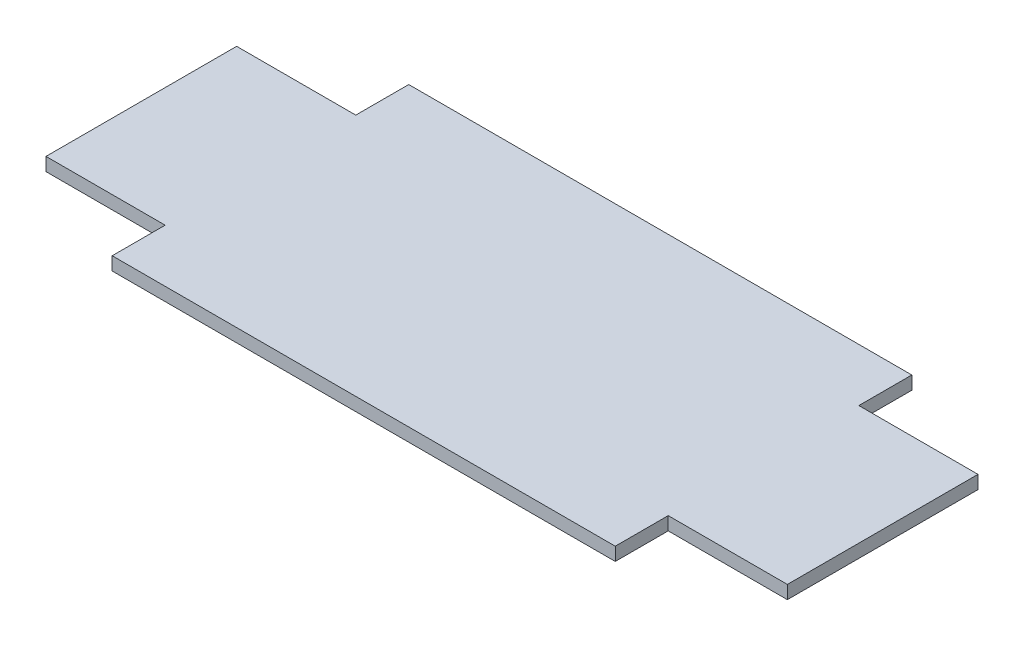
ISO-10303-21;
HEADER;
FILE_DESCRIPTION(('STEP AP214'),'2;1');
FILE_NAME('part.step','',(''),(''),'','','');
FILE_SCHEMA(('AUTOMOTIVE_DESIGN { 1 0 10303 214 1 1 1 1 }'));
ENDSEC;
DATA;
#1=APPLICATION_CONTEXT('core data for automotive mechanical design processes');
#2=APPLICATION_PROTOCOL_DEFINITION('international standard','automotive_design',2000,#1);
#3=PRODUCT_CONTEXT('',#1,'mechanical');
#4=PRODUCT('Part','Part','',(#3));
#5=PRODUCT_RELATED_PRODUCT_CATEGORY('part','',(#4));
#6=PRODUCT_DEFINITION_FORMATION('','',#4);
#7=PRODUCT_DEFINITION_CONTEXT('part definition',#1,'design');
#8=PRODUCT_DEFINITION('design','',#6,#7);
#9=PRODUCT_DEFINITION_SHAPE('','',#8);
#10=(LENGTH_UNIT() NAMED_UNIT(*) SI_UNIT(.MILLI.,.METRE.));
#11=(NAMED_UNIT(*) PLANE_ANGLE_UNIT() SI_UNIT($,.RADIAN.));
#12=(NAMED_UNIT(*) SI_UNIT($,.STERADIAN.) SOLID_ANGLE_UNIT());
#13=UNCERTAINTY_MEASURE_WITH_UNIT(LENGTH_MEASURE(1.E-05),#10,'distance_accuracy_value','');
#14=(GEOMETRIC_REPRESENTATION_CONTEXT(3) GLOBAL_UNCERTAINTY_ASSIGNED_CONTEXT((#13)) GLOBAL_UNIT_ASSIGNED_CONTEXT((#10,
#11,#12)) REPRESENTATION_CONTEXT('',''));
#15=CARTESIAN_POINT('',(0.,0.,0.));
#16=DIRECTION('',(0.,0.,1.));
#17=DIRECTION('',(1.,0.,0.));
#18=AXIS2_PLACEMENT_3D('',#15,#16,#17);
#19=CARTESIAN_POINT('',(235.,5.,112.));
#20=DIRECTION('',(-1.,0.,0.));
#21=DIRECTION('',(0.,0.,1.));
#22=AXIS2_PLACEMENT_3D('',#19,#20,#21);
#23=PLANE('',#22);
#24=DIRECTION('',(0.,0.,-1.));
#25=VECTOR('',#24,1.);
#26=CARTESIAN_POINT('',(235.,0.,112.));
#27=LINE('',#26,#25);
#28=CARTESIAN_POINT('',(235.,0.,112.));
#29=VERTEX_POINT('',#28);
#30=CARTESIAN_POINT('',(235.,0.,92.));
#31=VERTEX_POINT('',#30);
#32=EDGE_CURVE('E153',#29,#31,#27,.T.);
#33=ORIENTED_EDGE('',*,*,#32,.T.);
#34=DIRECTION('',(0.,-1.,0.));
#35=VECTOR('',#34,1.);
#36=CARTESIAN_POINT('',(235.,5.,92.));
#37=LINE('',#36,#35);
#38=CARTESIAN_POINT('',(235.,5.,92.));
#39=VERTEX_POINT('',#38);
#40=EDGE_CURVE('E11',#39,#31,#37,.T.);
#41=ORIENTED_EDGE('',*,*,#40,.F.);
#42=DIRECTION('',(0.,0.,-1.));
#43=VECTOR('',#42,1.);
#44=CARTESIAN_POINT('',(235.,5.,112.));
#45=LINE('',#44,#43);
#46=CARTESIAN_POINT('',(235.,5.,112.));
#47=VERTEX_POINT('',#46);
#48=EDGE_CURVE('E175',#47,#39,#45,.T.);
#49=ORIENTED_EDGE('',*,*,#48,.F.);
#50=DIRECTION('',(0.,-1.,0.));
#51=VECTOR('',#50,1.);
#52=CARTESIAN_POINT('',(235.,5.,112.));
#53=LINE('',#52,#51);
#54=EDGE_CURVE('E149',#47,#29,#53,.T.);
#55=ORIENTED_EDGE('',*,*,#54,.T.);
#56=EDGE_LOOP('',(#33,#41,#49,#55));
#57=FACE_BOUND('',#56,.T.);
#58=ADVANCED_FACE('F33',(#57),#23,.F.);
#59=CARTESIAN_POINT('',(235.,5.,92.));
#60=DIRECTION('',(0.,0.,-1.));
#61=DIRECTION('',(-1.,0.,0.));
#62=AXIS2_PLACEMENT_3D('',#59,#60,#61);
#63=PLANE('',#62);
#64=DIRECTION('',(1.,0.,0.));
#65=VECTOR('',#64,1.);
#66=CARTESIAN_POINT('',(235.,0.,92.));
#67=LINE('',#66,#65);
#68=CARTESIAN_POINT('',(280.,0.,92.));
#69=VERTEX_POINT('',#68);
#70=EDGE_CURVE('E156',#31,#69,#67,.T.);
#71=ORIENTED_EDGE('',*,*,#70,.T.);
#72=DIRECTION('',(0.,-1.,0.));
#73=VECTOR('',#72,1.);
#74=CARTESIAN_POINT('',(280.,5.,92.));
#75=LINE('',#74,#73);
#76=CARTESIAN_POINT('',(280.,5.,92.));
#77=VERTEX_POINT('',#76);
#78=EDGE_CURVE('E41',#77,#69,#75,.T.);
#79=ORIENTED_EDGE('',*,*,#78,.F.);
#80=DIRECTION('',(1.,0.,0.));
#81=VECTOR('',#80,1.);
#82=CARTESIAN_POINT('',(235.,5.,92.));
#83=LINE('',#82,#81);
#84=EDGE_CURVE('E104',#39,#77,#83,.T.);
#85=ORIENTED_EDGE('',*,*,#84,.F.);
#86=ORIENTED_EDGE('',*,*,#40,.T.);
#87=EDGE_LOOP('',(#71,#79,#85,#86));
#88=FACE_BOUND('',#87,.T.);
#89=ADVANCED_FACE('F253',(#88),#63,.F.);
#90=CARTESIAN_POINT('',(280.,5.,92.));
#91=DIRECTION('',(-1.,0.,0.));
#92=DIRECTION('',(0.,0.,1.));
#93=AXIS2_PLACEMENT_3D('',#90,#91,#92);
#94=PLANE('',#93);
#95=DIRECTION('',(0.,0.,-1.));
#96=VECTOR('',#95,1.);
#97=CARTESIAN_POINT('',(280.,0.,92.));
#98=LINE('',#97,#96);
#99=CARTESIAN_POINT('',(280.,0.,20.));
#100=VERTEX_POINT('',#99);
#101=EDGE_CURVE('E158',#69,#100,#98,.T.);
#102=ORIENTED_EDGE('',*,*,#101,.T.);
#103=DIRECTION('',(0.,-1.,0.));
#104=VECTOR('',#103,1.);
#105=CARTESIAN_POINT('',(280.,5.,20.));
#106=LINE('',#105,#104);
#107=CARTESIAN_POINT('',(280.,5.,20.));
#108=VERTEX_POINT('',#107);
#109=EDGE_CURVE('E194',#108,#100,#106,.T.);
#110=ORIENTED_EDGE('',*,*,#109,.F.);
#111=DIRECTION('',(0.,0.,-1.));
#112=VECTOR('',#111,1.);
#113=CARTESIAN_POINT('',(280.,5.,92.));
#114=LINE('',#113,#112);
#115=EDGE_CURVE('E202',#77,#108,#114,.T.);
#116=ORIENTED_EDGE('',*,*,#115,.F.);
#117=ORIENTED_EDGE('',*,*,#78,.T.);
#118=EDGE_LOOP('',(#102,#110,#116,#117));
#119=FACE_BOUND('',#118,.T.);
#120=ADVANCED_FACE('F200',(#119),#94,.F.);
#121=CARTESIAN_POINT('',(235.,5.,20.));
#122=DIRECTION('',(0.,0.,1.));
#123=DIRECTION('',(1.,0.,0.));
#124=AXIS2_PLACEMENT_3D('',#121,#122,#123);
#125=PLANE('',#124);
#126=DIRECTION('',(-1.,0.,0.));
#127=VECTOR('',#126,1.);
#128=CARTESIAN_POINT('',(235.,0.,20.));
#129=LINE('',#128,#127);
#130=CARTESIAN_POINT('',(235.,0.,20.));
#131=VERTEX_POINT('',#130);
#132=EDGE_CURVE('E160',#100,#131,#129,.T.);
#133=ORIENTED_EDGE('',*,*,#132,.T.);
#134=DIRECTION('',(0.,-1.,0.));
#135=VECTOR('',#134,1.);
#136=CARTESIAN_POINT('',(235.,5.,20.));
#137=LINE('',#136,#135);
#138=CARTESIAN_POINT('',(235.,5.,20.));
#139=VERTEX_POINT('',#138);
#140=EDGE_CURVE('E191',#139,#131,#137,.T.);
#141=ORIENTED_EDGE('',*,*,#140,.F.);
#142=DIRECTION('',(-1.,0.,0.));
#143=VECTOR('',#142,1.);
#144=CARTESIAN_POINT('',(235.,5.,20.));
#145=LINE('',#144,#143);
#146=EDGE_CURVE('E220',#108,#139,#145,.T.);
#147=ORIENTED_EDGE('',*,*,#146,.F.);
#148=ORIENTED_EDGE('',*,*,#109,.T.);
#149=EDGE_LOOP('',(#133,#141,#147,#148));
#150=FACE_BOUND('',#149,.T.);
#151=ADVANCED_FACE('F211',(#150),#125,.F.);
#152=CARTESIAN_POINT('',(235.,5.,0.));
#153=DIRECTION('',(-1.,0.,0.));
#154=DIRECTION('',(0.,0.,1.));
#155=AXIS2_PLACEMENT_3D('',#152,#153,#154);
#156=PLANE('',#155);
#157=DIRECTION('',(0.,0.,-1.));
#158=VECTOR('',#157,1.);
#159=CARTESIAN_POINT('',(235.,0.,0.));
#160=LINE('',#159,#158);
#161=CARTESIAN_POINT('',(235.,0.,0.));
#162=VERTEX_POINT('',#161);
#163=EDGE_CURVE('E162',#131,#162,#160,.T.);
#164=ORIENTED_EDGE('',*,*,#163,.T.);
#165=DIRECTION('',(0.,-1.,0.));
#166=VECTOR('',#165,1.);
#167=CARTESIAN_POINT('',(235.,5.,0.));
#168=LINE('',#167,#166);
#169=CARTESIAN_POINT('',(235.,5.,0.));
#170=VERTEX_POINT('',#169);
#171=EDGE_CURVE('E188',#170,#162,#168,.T.);
#172=ORIENTED_EDGE('',*,*,#171,.F.);
#173=DIRECTION('',(0.,0.,-1.));
#174=VECTOR('',#173,1.);
#175=CARTESIAN_POINT('',(235.,5.,0.));
#176=LINE('',#175,#174);
#177=EDGE_CURVE('E217',#139,#170,#176,.T.);
#178=ORIENTED_EDGE('',*,*,#177,.F.);
#179=ORIENTED_EDGE('',*,*,#140,.T.);
#180=EDGE_LOOP('',(#164,#172,#178,#179));
#181=FACE_BOUND('',#180,.T.);
#182=ADVANCED_FACE('F215',(#181),#156,.F.);
#183=CARTESIAN_POINT('',(45.,5.,0.));
#184=DIRECTION('',(0.,0.,1.));
#185=DIRECTION('',(1.,0.,0.));
#186=AXIS2_PLACEMENT_3D('',#183,#184,#185);
#187=PLANE('',#186);
#188=DIRECTION('',(-1.,0.,0.));
#189=VECTOR('',#188,1.);
#190=CARTESIAN_POINT('',(45.,0.,0.));
#191=LINE('',#190,#189);
#192=CARTESIAN_POINT('',(45.,0.,0.));
#193=VERTEX_POINT('',#192);
#194=EDGE_CURVE('E164',#162,#193,#191,.T.);
#195=ORIENTED_EDGE('',*,*,#194,.T.);
#196=DIRECTION('',(0.,-1.,0.));
#197=VECTOR('',#196,1.);
#198=CARTESIAN_POINT('',(45.,5.,0.));
#199=LINE('',#198,#197);
#200=CARTESIAN_POINT('',(45.,5.,0.));
#201=VERTEX_POINT('',#200);
#202=EDGE_CURVE('E185',#201,#193,#199,.T.);
#203=ORIENTED_EDGE('',*,*,#202,.F.);
#204=DIRECTION('',(-1.,0.,0.));
#205=VECTOR('',#204,1.);
#206=CARTESIAN_POINT('',(45.,5.,0.));
#207=LINE('',#206,#205);
#208=EDGE_CURVE('E219',#170,#201,#207,.T.);
#209=ORIENTED_EDGE('',*,*,#208,.F.);
#210=ORIENTED_EDGE('',*,*,#171,.T.);
#211=EDGE_LOOP('',(#195,#203,#209,#210));
#212=FACE_BOUND('',#211,.T.);
#213=ADVANCED_FACE('F266',(#212),#187,.F.);
#214=CARTESIAN_POINT('',(45.,5.,0.));
#215=DIRECTION('',(1.,0.,0.));
#216=DIRECTION('',(0.,0.,-1.));
#217=AXIS2_PLACEMENT_3D('',#214,#215,#216);
#218=PLANE('',#217);
#219=DIRECTION('',(0.,0.,1.));
#220=VECTOR('',#219,1.);
#221=CARTESIAN_POINT('',(45.,0.,0.));
#222=LINE('',#221,#220);
#223=CARTESIAN_POINT('',(45.,0.,20.));
#224=VERTEX_POINT('',#223);
#225=EDGE_CURVE('E166',#193,#224,#222,.T.);
#226=ORIENTED_EDGE('',*,*,#225,.T.);
#227=DIRECTION('',(0.,-1.,0.));
#228=VECTOR('',#227,1.);
#229=CARTESIAN_POINT('',(45.,5.,20.));
#230=LINE('',#229,#228);
#231=CARTESIAN_POINT('',(45.,5.,20.));
#232=VERTEX_POINT('',#231);
#233=EDGE_CURVE('E182',#232,#224,#230,.T.);
#234=ORIENTED_EDGE('',*,*,#233,.F.);
#235=DIRECTION('',(0.,0.,1.));
#236=VECTOR('',#235,1.);
#237=CARTESIAN_POINT('',(45.,5.,0.));
#238=LINE('',#237,#236);
#239=EDGE_CURVE('E222',#201,#232,#238,.T.);
#240=ORIENTED_EDGE('',*,*,#239,.F.);
#241=ORIENTED_EDGE('',*,*,#202,.T.);
#242=EDGE_LOOP('',(#226,#234,#240,#241));
#243=FACE_BOUND('',#242,.T.);
#244=ADVANCED_FACE('F269',(#243),#218,.F.);
#245=CARTESIAN_POINT('',(45.,5.,20.));
#246=DIRECTION('',(0.,0.,1.));
#247=DIRECTION('',(1.,0.,0.));
#248=AXIS2_PLACEMENT_3D('',#245,#246,#247);
#249=PLANE('',#248);
#250=DIRECTION('',(-1.,0.,0.));
#251=VECTOR('',#250,1.);
#252=CARTESIAN_POINT('',(45.,0.,20.));
#253=LINE('',#252,#251);
#254=CARTESIAN_POINT('',(0.,0.,20.));
#255=VERTEX_POINT('',#254);
#256=EDGE_CURVE('E168',#224,#255,#253,.T.);
#257=ORIENTED_EDGE('',*,*,#256,.T.);
#258=DIRECTION('',(0.,-1.,0.));
#259=VECTOR('',#258,1.);
#260=CARTESIAN_POINT('',(0.,5.,20.));
#261=LINE('',#260,#259);
#262=CARTESIAN_POINT('',(0.,5.,20.));
#263=VERTEX_POINT('',#262);
#264=EDGE_CURVE('E179',#263,#255,#261,.T.);
#265=ORIENTED_EDGE('',*,*,#264,.F.);
#266=DIRECTION('',(-1.,0.,0.));
#267=VECTOR('',#266,1.);
#268=CARTESIAN_POINT('',(45.,5.,20.));
#269=LINE('',#268,#267);
#270=EDGE_CURVE('E228',#232,#263,#269,.T.);
#271=ORIENTED_EDGE('',*,*,#270,.F.);
#272=ORIENTED_EDGE('',*,*,#233,.T.);
#273=EDGE_LOOP('',(#257,#265,#271,#272));
#274=FACE_BOUND('',#273,.T.);
#275=ADVANCED_FACE('F234',(#274),#249,.F.);
#276=CARTESIAN_POINT('',(0.,5.,20.));
#277=DIRECTION('',(1.,0.,0.));
#278=DIRECTION('',(0.,0.,-1.));
#279=AXIS2_PLACEMENT_3D('',#276,#277,#278);
#280=PLANE('',#279);
#281=DIRECTION('',(0.,0.,1.));
#282=VECTOR('',#281,1.);
#283=CARTESIAN_POINT('',(0.,0.,20.));
#284=LINE('',#283,#282);
#285=CARTESIAN_POINT('',(0.,0.,92.));
#286=VERTEX_POINT('',#285);
#287=EDGE_CURVE('E170',#255,#286,#284,.T.);
#288=ORIENTED_EDGE('',*,*,#287,.T.);
#289=DIRECTION('',(0.,-1.,0.));
#290=VECTOR('',#289,1.);
#291=CARTESIAN_POINT('',(0.,5.,92.));
#292=LINE('',#291,#290);
#293=CARTESIAN_POINT('',(0.,5.,92.));
#294=VERTEX_POINT('',#293);
#295=EDGE_CURVE('E144',#294,#286,#292,.T.);
#296=ORIENTED_EDGE('',*,*,#295,.F.);
#297=DIRECTION('',(0.,0.,1.));
#298=VECTOR('',#297,1.);
#299=CARTESIAN_POINT('',(0.,5.,20.));
#300=LINE('',#299,#298);
#301=EDGE_CURVE('E135',#263,#294,#300,.T.);
#302=ORIENTED_EDGE('',*,*,#301,.F.);
#303=ORIENTED_EDGE('',*,*,#264,.T.);
#304=EDGE_LOOP('',(#288,#296,#302,#303));
#305=FACE_BOUND('',#304,.T.);
#306=ADVANCED_FACE('F238',(#305),#280,.F.);
#307=CARTESIAN_POINT('',(45.,5.,92.));
#308=DIRECTION('',(0.,0.,-1.));
#309=DIRECTION('',(-1.,0.,0.));
#310=AXIS2_PLACEMENT_3D('',#307,#308,#309);
#311=PLANE('',#310);
#312=DIRECTION('',(1.,0.,0.));
#313=VECTOR('',#312,1.);
#314=CARTESIAN_POINT('',(45.,0.,92.));
#315=LINE('',#314,#313);
#316=CARTESIAN_POINT('',(45.,0.,92.));
#317=VERTEX_POINT('',#316);
#318=EDGE_CURVE('E143',#286,#317,#315,.T.);
#319=ORIENTED_EDGE('',*,*,#318,.T.);
#320=DIRECTION('',(0.,-1.,0.));
#321=VECTOR('',#320,1.);
#322=CARTESIAN_POINT('',(45.,5.,92.));
#323=LINE('',#322,#321);
#324=CARTESIAN_POINT('',(45.,5.,92.));
#325=VERTEX_POINT('',#324);
#326=EDGE_CURVE('E140',#325,#317,#323,.T.);
#327=ORIENTED_EDGE('',*,*,#326,.F.);
#328=DIRECTION('',(1.,0.,0.));
#329=VECTOR('',#328,1.);
#330=CARTESIAN_POINT('',(45.,5.,92.));
#331=LINE('',#330,#329);
#332=EDGE_CURVE('E129',#294,#325,#331,.T.);
#333=ORIENTED_EDGE('',*,*,#332,.F.);
#334=ORIENTED_EDGE('',*,*,#295,.T.);
#335=EDGE_LOOP('',(#319,#327,#333,#334));
#336=FACE_BOUND('',#335,.T.);
#337=ADVANCED_FACE('F141',(#336),#311,.F.);
#338=CARTESIAN_POINT('',(45.,5.,112.));
#339=DIRECTION('',(1.,0.,0.));
#340=DIRECTION('',(0.,0.,-1.));
#341=AXIS2_PLACEMENT_3D('',#338,#339,#340);
#342=PLANE('',#341);
#343=DIRECTION('',(0.,0.,1.));
#344=VECTOR('',#343,1.);
#345=CARTESIAN_POINT('',(45.,0.,112.));
#346=LINE('',#345,#344);
#347=CARTESIAN_POINT('',(45.,0.,112.));
#348=VERTEX_POINT('',#347);
#349=EDGE_CURVE('E90',#317,#348,#346,.T.);
#350=ORIENTED_EDGE('',*,*,#349,.T.);
#351=DIRECTION('',(0.,-1.,0.));
#352=VECTOR('',#351,1.);
#353=CARTESIAN_POINT('',(45.,5.,112.));
#354=LINE('',#353,#352);
#355=CARTESIAN_POINT('',(45.,5.,112.));
#356=VERTEX_POINT('',#355);
#357=EDGE_CURVE('E145',#356,#348,#354,.T.);
#358=ORIENTED_EDGE('',*,*,#357,.F.);
#359=DIRECTION('',(0.,0.,1.));
#360=VECTOR('',#359,1.);
#361=CARTESIAN_POINT('',(45.,5.,112.));
#362=LINE('',#361,#360);
#363=EDGE_CURVE('E133',#325,#356,#362,.T.);
#364=ORIENTED_EDGE('',*,*,#363,.F.);
#365=ORIENTED_EDGE('',*,*,#326,.T.);
#366=EDGE_LOOP('',(#350,#358,#364,#365));
#367=FACE_BOUND('',#366,.T.);
#368=ADVANCED_FACE('F147',(#367),#342,.F.);
#369=CARTESIAN_POINT('',(45.,5.,112.));
#370=DIRECTION('',(0.,0.,-1.));
#371=DIRECTION('',(-1.,0.,0.));
#372=AXIS2_PLACEMENT_3D('',#369,#370,#371);
#373=PLANE('',#372);
#374=DIRECTION('',(1.,0.,0.));
#375=VECTOR('',#374,1.);
#376=CARTESIAN_POINT('',(45.,0.,112.));
#377=LINE('',#376,#375);
#378=EDGE_CURVE('E96',#348,#29,#377,.T.);
#379=ORIENTED_EDGE('',*,*,#378,.T.);
#380=ORIENTED_EDGE('',*,*,#54,.F.);
#381=DIRECTION('',(1.,0.,0.));
#382=VECTOR('',#381,1.);
#383=CARTESIAN_POINT('',(45.,5.,112.));
#384=LINE('',#383,#382);
#385=EDGE_CURVE('E49',#356,#47,#384,.T.);
#386=ORIENTED_EDGE('',*,*,#385,.F.);
#387=ORIENTED_EDGE('',*,*,#357,.T.);
#388=EDGE_LOOP('',(#379,#380,#386,#387));
#389=FACE_BOUND('',#388,.T.);
#390=ADVANCED_FACE('F242',(#389),#373,.F.);
#391=CARTESIAN_POINT('',(0.,5.,0.));
#392=DIRECTION('',(0.,-1.,0.));
#393=DIRECTION('',(0.,0.,-1.));
#394=AXIS2_PLACEMENT_3D('',#391,#392,#393);
#395=PLANE('',#394);
#396=ORIENTED_EDGE('',*,*,#48,.T.);
#397=ORIENTED_EDGE('',*,*,#84,.T.);
#398=ORIENTED_EDGE('',*,*,#115,.T.);
#399=ORIENTED_EDGE('',*,*,#146,.T.);
#400=ORIENTED_EDGE('',*,*,#177,.T.);
#401=ORIENTED_EDGE('',*,*,#208,.T.);
#402=ORIENTED_EDGE('',*,*,#239,.T.);
#403=ORIENTED_EDGE('',*,*,#270,.T.);
#404=ORIENTED_EDGE('',*,*,#301,.T.);
#405=ORIENTED_EDGE('',*,*,#332,.T.);
#406=ORIENTED_EDGE('',*,*,#363,.T.);
#407=ORIENTED_EDGE('',*,*,#385,.T.);
#408=EDGE_LOOP('',(#396,#397,#398,#399,#400,#401,#402,#403,#404,#405,#406,#407));
#409=FACE_BOUND('',#408,.T.);
#410=ADVANCED_FACE('F131',(#409),#395,.F.);
#411=CARTESIAN_POINT('',(0.,0.,0.));
#412=DIRECTION('',(0.,-1.,0.));
#413=DIRECTION('',(0.,0.,-1.));
#414=AXIS2_PLACEMENT_3D('',#411,#412,#413);
#415=PLANE('',#414);
#416=ORIENTED_EDGE('',*,*,#32,.F.);
#417=ORIENTED_EDGE('',*,*,#378,.F.);
#418=ORIENTED_EDGE('',*,*,#349,.F.);
#419=ORIENTED_EDGE('',*,*,#318,.F.);
#420=ORIENTED_EDGE('',*,*,#287,.F.);
#421=ORIENTED_EDGE('',*,*,#256,.F.);
#422=ORIENTED_EDGE('',*,*,#225,.F.);
#423=ORIENTED_EDGE('',*,*,#194,.F.);
#424=ORIENTED_EDGE('',*,*,#163,.F.);
#425=ORIENTED_EDGE('',*,*,#132,.F.);
#426=ORIENTED_EDGE('',*,*,#101,.F.);
#427=ORIENTED_EDGE('',*,*,#70,.F.);
#428=EDGE_LOOP('',(#416,#417,#418,#419,#420,#421,#422,#423,#424,#425,#426,#427));
#429=FACE_BOUND('',#428,.T.);
#430=ADVANCED_FACE('F206',(#429),#415,.T.);
#431=CLOSED_SHELL('',(#58,#89,#120,#151,#182,#213,#244,#275,#306,#337,#368,#390,#410,#430));
#432=MANIFOLD_SOLID_BREP('B2',#431);
#433=ADVANCED_BREP_SHAPE_REPRESENTATION('',(#18,#432),#14);
#434=SHAPE_DEFINITION_REPRESENTATION(#9,#433);
ENDSEC;
END-ISO-10303-21;
